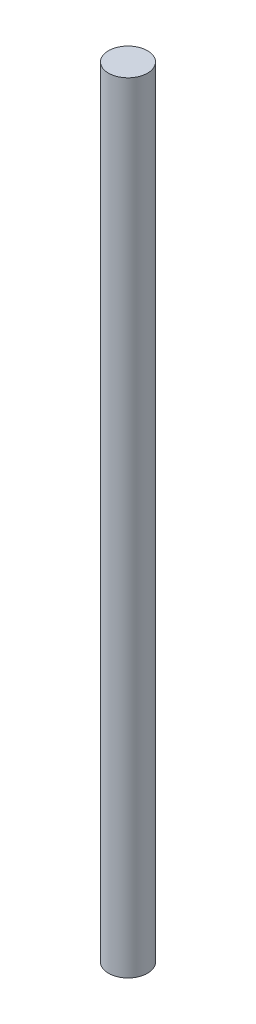
ISO-10303-21;
HEADER;
FILE_DESCRIPTION(('STEP AP214'),'2;1');
FILE_NAME('part.step','',(''),(''),'','','');
FILE_SCHEMA(('AUTOMOTIVE_DESIGN { 1 0 10303 214 1 1 1 1 }'));
ENDSEC;
DATA;
#1=APPLICATION_CONTEXT('core data for automotive mechanical design processes');
#2=APPLICATION_PROTOCOL_DEFINITION('international standard','automotive_design',2000,#1);
#3=PRODUCT_CONTEXT('',#1,'mechanical');
#4=PRODUCT('Part','Part','',(#3));
#5=PRODUCT_RELATED_PRODUCT_CATEGORY('part','',(#4));
#6=PRODUCT_DEFINITION_FORMATION('','',#4);
#7=PRODUCT_DEFINITION_CONTEXT('part definition',#1,'design');
#8=PRODUCT_DEFINITION('design','',#6,#7);
#9=PRODUCT_DEFINITION_SHAPE('','',#8);
#10=(LENGTH_UNIT() NAMED_UNIT(*) SI_UNIT(.MILLI.,.METRE.));
#11=(NAMED_UNIT(*) PLANE_ANGLE_UNIT() SI_UNIT($,.RADIAN.));
#12=(NAMED_UNIT(*) SI_UNIT($,.STERADIAN.) SOLID_ANGLE_UNIT());
#13=UNCERTAINTY_MEASURE_WITH_UNIT(LENGTH_MEASURE(1.E-05),#10,'distance_accuracy_value','');
#14=(GEOMETRIC_REPRESENTATION_CONTEXT(3) GLOBAL_UNCERTAINTY_ASSIGNED_CONTEXT((#13)) GLOBAL_UNIT_ASSIGNED_CONTEXT((#10,
#11,#12)) REPRESENTATION_CONTEXT('',''));
#15=CARTESIAN_POINT('',(0.,0.,0.));
#16=DIRECTION('',(0.,0.,1.));
#17=DIRECTION('',(1.,0.,0.));
#18=AXIS2_PLACEMENT_3D('',#15,#16,#17);
#19=CARTESIAN_POINT('',(0.,50.,0.));
#20=DIRECTION('',(0.,-1.,0.));
#21=DIRECTION('',(0.,0.,-1.));
#22=AXIS2_PLACEMENT_3D('',#19,#20,#21);
#23=CYLINDRICAL_SURFACE('',#22,2.5);
#24=CARTESIAN_POINT('',(0.,50.,0.));
#25=DIRECTION('',(0.,1.,0.));
#26=DIRECTION('',(0.,0.,1.));
#27=AXIS2_PLACEMENT_3D('',#24,#25,#26);
#28=CIRCLE('',#27,2.5);
#29=CARTESIAN_POINT('',(0.,50.,2.5));
#30=VERTEX_POINT('',#29);
#31=EDGE_CURVE('E10',#30,#30,#28,.T.);
#32=ORIENTED_EDGE('',*,*,#31,.F.);
#33=EDGE_LOOP('',(#32));
#34=FACE_BOUND('',#33,.T.);
#35=CARTESIAN_POINT('',(0.,-50.,0.));
#36=DIRECTION('',(0.,1.,0.));
#37=DIRECTION('',(0.,0.,1.));
#38=AXIS2_PLACEMENT_3D('',#35,#36,#37);
#39=CIRCLE('',#38,2.5);
#40=CARTESIAN_POINT('',(0.,-50.,2.5));
#41=VERTEX_POINT('',#40);
#42=EDGE_CURVE('E37',#41,#41,#39,.T.);
#43=ORIENTED_EDGE('',*,*,#42,.T.);
#44=EDGE_LOOP('',(#43));
#45=FACE_BOUND('',#44,.T.);
#46=ADVANCED_FACE('F34',(#34,#45),#23,.T.);
#47=CARTESIAN_POINT('',(0.,50.,0.));
#48=DIRECTION('',(0.,1.,0.));
#49=DIRECTION('',(0.,0.,1.));
#50=AXIS2_PLACEMENT_3D('',#47,#48,#49);
#51=PLANE('',#50);
#52=ORIENTED_EDGE('',*,*,#31,.T.);
#53=EDGE_LOOP('',(#52));
#54=FACE_BOUND('',#53,.T.);
#55=ADVANCED_FACE('F49',(#54),#51,.T.);
#56=CARTESIAN_POINT('',(0.,-50.,0.));
#57=DIRECTION('',(0.,1.,0.));
#58=DIRECTION('',(0.,0.,1.));
#59=AXIS2_PLACEMENT_3D('',#56,#57,#58);
#60=PLANE('',#59);
#61=ORIENTED_EDGE('',*,*,#42,.F.);
#62=EDGE_LOOP('',(#61));
#63=FACE_BOUND('',#62,.T.);
#64=ADVANCED_FACE('F47',(#63),#60,.F.);
#65=CLOSED_SHELL('',(#46,#55,#64));
#66=MANIFOLD_SOLID_BREP('B2',#65);
#67=ADVANCED_BREP_SHAPE_REPRESENTATION('',(#18,#66),#14);
#68=SHAPE_DEFINITION_REPRESENTATION(#9,#67);
ENDSEC;
END-ISO-10303-21;
